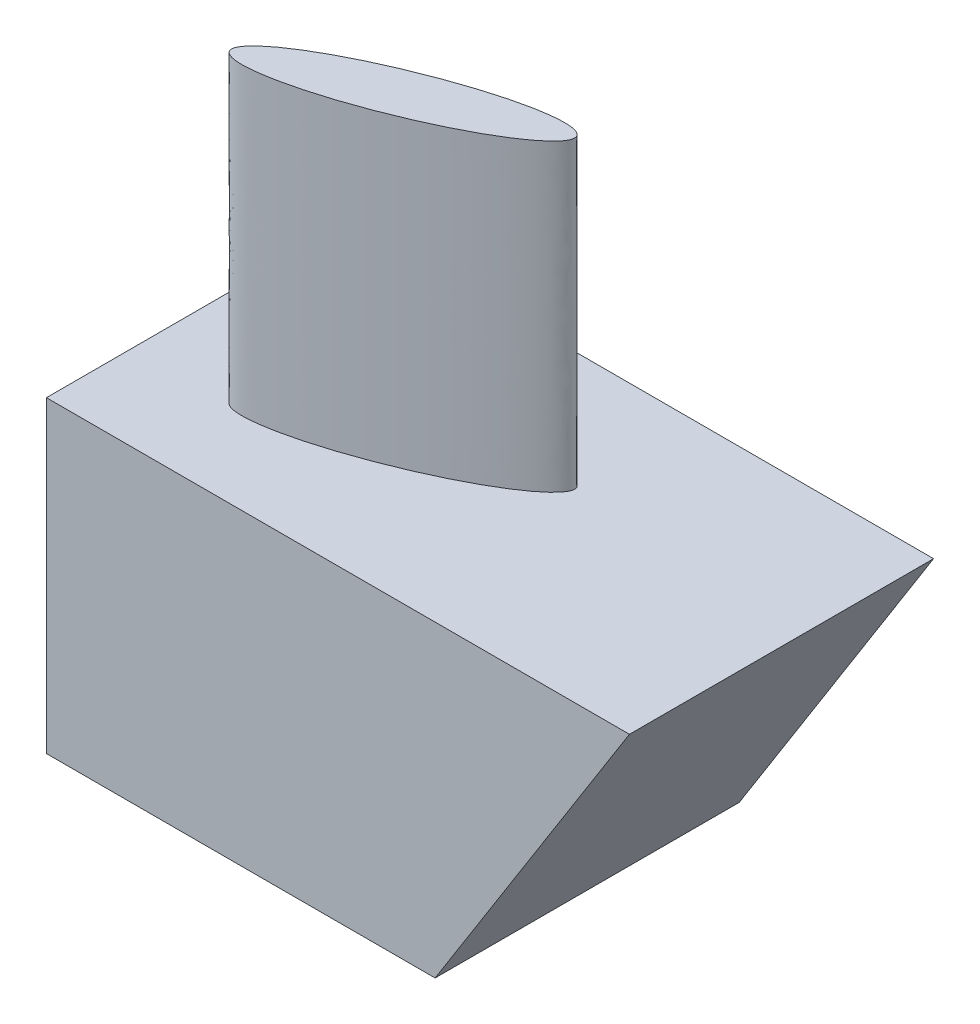
ISO-10303-21;
HEADER;
FILE_DESCRIPTION(('STEP AP214'),'2;1');
FILE_NAME('part.step','',(''),(''),'','','');
FILE_SCHEMA(('AUTOMOTIVE_DESIGN { 1 0 10303 214 1 1 1 1 }'));
ENDSEC;
DATA;
#1=APPLICATION_CONTEXT('core data for automotive mechanical design processes');
#2=APPLICATION_PROTOCOL_DEFINITION('international standard','automotive_design',2000,#1);
#3=PRODUCT_CONTEXT('',#1,'mechanical');
#4=PRODUCT('Part','Part','',(#3));
#5=PRODUCT_RELATED_PRODUCT_CATEGORY('part','',(#4));
#6=PRODUCT_DEFINITION_FORMATION('','',#4);
#7=PRODUCT_DEFINITION_CONTEXT('part definition',#1,'design');
#8=PRODUCT_DEFINITION('design','',#6,#7);
#9=PRODUCT_DEFINITION_SHAPE('','',#8);
#10=(LENGTH_UNIT() NAMED_UNIT(*) SI_UNIT(.MILLI.,.METRE.));
#11=(NAMED_UNIT(*) PLANE_ANGLE_UNIT() SI_UNIT($,.RADIAN.));
#12=(NAMED_UNIT(*) SI_UNIT($,.STERADIAN.) SOLID_ANGLE_UNIT());
#13=UNCERTAINTY_MEASURE_WITH_UNIT(LENGTH_MEASURE(1.E-05),#10,'distance_accuracy_value','');
#14=(GEOMETRIC_REPRESENTATION_CONTEXT(3) GLOBAL_UNCERTAINTY_ASSIGNED_CONTEXT((#13)) GLOBAL_UNIT_ASSIGNED_CONTEXT((#10,
#11,#12)) REPRESENTATION_CONTEXT('',''));
#15=CARTESIAN_POINT('',(0.,0.,0.));
#16=DIRECTION('',(0.,0.,1.));
#17=DIRECTION('',(1.,0.,0.));
#18=AXIS2_PLACEMENT_3D('',#15,#16,#17);
#19=CARTESIAN_POINT('',(0.,0.,79.502));
#20=DIRECTION('',(1.,0.,0.));
#21=DIRECTION('',(0.,0.,-1.));
#22=AXIS2_PLACEMENT_3D('',#19,#20,#21);
#23=PLANE('',#22);
#24=DIRECTION('',(0.,-1.,0.));
#25=VECTOR('',#24,1.);
#26=CARTESIAN_POINT('',(0.,0.,0.));
#27=LINE('',#26,#25);
#28=CARTESIAN_POINT('',(0.,80.5724673818545,0.));
#29=VERTEX_POINT('',#28);
#30=CARTESIAN_POINT('',(0.,0.,0.));
#31=VERTEX_POINT('',#30);
#32=EDGE_CURVE('E99',#29,#31,#27,.T.);
#33=ORIENTED_EDGE('',*,*,#32,.T.);
#34=DIRECTION('',(0.,0.,-1.));
#35=VECTOR('',#34,1.);
#36=CARTESIAN_POINT('',(0.,0.,79.502));
#37=LINE('',#36,#35);
#38=CARTESIAN_POINT('',(0.,0.,79.502));
#39=VERTEX_POINT('',#38);
#40=EDGE_CURVE('E41',#39,#31,#37,.T.);
#41=ORIENTED_EDGE('',*,*,#40,.F.);
#42=DIRECTION('',(0.,-1.,0.));
#43=VECTOR('',#42,1.);
#44=CARTESIAN_POINT('',(0.,0.,79.502));
#45=LINE('',#44,#43);
#46=CARTESIAN_POINT('',(0.,80.5724673818545,79.502));
#47=VERTEX_POINT('',#46);
#48=EDGE_CURVE('E85',#47,#39,#45,.T.);
#49=ORIENTED_EDGE('',*,*,#48,.F.);
#50=DIRECTION('',(0.,0.,-1.));
#51=VECTOR('',#50,1.);
#52=CARTESIAN_POINT('',(0.,80.5724673818545,79.502));
#53=LINE('',#52,#51);
#54=EDGE_CURVE('E95',#47,#29,#53,.T.);
#55=ORIENTED_EDGE('',*,*,#54,.T.);
#56=EDGE_LOOP('',(#33,#41,#49,#55));
#57=FACE_BOUND('',#56,.T.);
#58=ADVANCED_FACE('F33',(#57),#23,.F.);
#59=CARTESIAN_POINT('',(0.,0.,79.502));
#60=DIRECTION('',(0.,1.,0.));
#61=DIRECTION('',(0.,0.,1.));
#62=AXIS2_PLACEMENT_3D('',#59,#60,#61);
#63=PLANE('',#62);
#64=DIRECTION('',(1.,0.,0.));
#65=VECTOR('',#64,1.);
#66=CARTESIAN_POINT('',(0.,0.,0.));
#67=LINE('',#66,#65);
#68=CARTESIAN_POINT('',(101.6,0.,0.));
#69=VERTEX_POINT('',#68);
#70=EDGE_CURVE('E90',#31,#69,#67,.T.);
#71=ORIENTED_EDGE('',*,*,#70,.T.);
#72=DIRECTION('',(0.,0.,-1.));
#73=VECTOR('',#72,1.);
#74=CARTESIAN_POINT('',(101.6,0.,79.502));
#75=LINE('',#74,#73);
#76=CARTESIAN_POINT('',(101.6,0.,79.502));
#77=VERTEX_POINT('',#76);
#78=EDGE_CURVE('E88',#77,#69,#75,.T.);
#79=ORIENTED_EDGE('',*,*,#78,.F.);
#80=DIRECTION('',(1.,0.,0.));
#81=VECTOR('',#80,1.);
#82=CARTESIAN_POINT('',(0.,0.,79.502));
#83=LINE('',#82,#81);
#84=EDGE_CURVE('E80',#39,#77,#83,.T.);
#85=ORIENTED_EDGE('',*,*,#84,.F.);
#86=ORIENTED_EDGE('',*,*,#40,.T.);
#87=EDGE_LOOP('',(#71,#79,#85,#86));
#88=FACE_BOUND('',#87,.T.);
#89=ADVANCED_FACE('F89',(#88),#63,.F.);
#90=CARTESIAN_POINT('',(101.6,0.,79.502));
#91=DIRECTION('',(-0.845905169363301,0.533333333333333,0.));
#92=DIRECTION('',(-0.533333333333333,-0.845905169363301,0.));
#93=AXIS2_PLACEMENT_3D('',#90,#91,#92);
#94=PLANE('',#93);
#95=DIRECTION('',(0.533333333333333,0.845905169363301,0.));
#96=VECTOR('',#95,1.);
#97=CARTESIAN_POINT('',(101.6,0.,0.));
#98=LINE('',#97,#96);
#99=CARTESIAN_POINT('',(152.4,80.5724673818545,0.));
#100=VERTEX_POINT('',#99);
#101=EDGE_CURVE('E66',#69,#100,#98,.T.);
#102=ORIENTED_EDGE('',*,*,#101,.T.);
#103=DIRECTION('',(0.,0.,-1.));
#104=VECTOR('',#103,1.);
#105=CARTESIAN_POINT('',(152.4,80.5724673818545,79.502));
#106=LINE('',#105,#104);
#107=CARTESIAN_POINT('',(152.4,80.5724673818545,79.502));
#108=VERTEX_POINT('',#107);
#109=EDGE_CURVE('E91',#108,#100,#106,.T.);
#110=ORIENTED_EDGE('',*,*,#109,.F.);
#111=DIRECTION('',(0.533333333333333,0.845905169363301,0.));
#112=VECTOR('',#111,1.);
#113=CARTESIAN_POINT('',(101.6,0.,79.502));
#114=LINE('',#113,#112);
#115=EDGE_CURVE('E83',#77,#108,#114,.T.);
#116=ORIENTED_EDGE('',*,*,#115,.F.);
#117=ORIENTED_EDGE('',*,*,#78,.T.);
#118=EDGE_LOOP('',(#102,#110,#116,#117));
#119=FACE_BOUND('',#118,.T.);
#120=ADVANCED_FACE('F93',(#119),#94,.F.);
#121=CARTESIAN_POINT('',(0.,80.5724673818545,79.502));
#122=DIRECTION('',(0.,-1.,0.));
#123=DIRECTION('',(0.,0.,-1.));
#124=AXIS2_PLACEMENT_3D('',#121,#122,#123);
#125=PLANE('',#124);
#126=CARTESIAN_POINT('',(57.2688932842027,80.5724673818545,43.526743590462));
#127=DIRECTION('',(0.,1.,0.));
#128=DIRECTION('',(0.928759773710809,0.,-0.370682185620845));
#129=AXIS2_PLACEMENT_3D('',#126,#127,#128);
#130=ELLIPSE('',#129,34.8725221198214,7.13681948191102);
#131=CARTESIAN_POINT('',(89.6570890369333,80.5724673818545,30.6001208729754));
#132=VERTEX_POINT('',#131);
#133=EDGE_CURVE('E11',#132,#132,#130,.T.);
#134=ORIENTED_EDGE('',*,*,#133,.F.);
#135=EDGE_LOOP('',(#134));
#136=FACE_BOUND('',#135,.T.);
#137=DIRECTION('',(-1.,0.,0.));
#138=VECTOR('',#137,1.);
#139=CARTESIAN_POINT('',(0.,80.5724673818545,0.));
#140=LINE('',#139,#138);
#141=EDGE_CURVE('E72',#100,#29,#140,.T.);
#142=ORIENTED_EDGE('',*,*,#141,.T.);
#143=ORIENTED_EDGE('',*,*,#54,.F.);
#144=DIRECTION('',(-1.,0.,0.));
#145=VECTOR('',#144,1.);
#146=CARTESIAN_POINT('',(0.,80.5724673818545,79.502));
#147=LINE('',#146,#145);
#148=EDGE_CURVE('E49',#108,#47,#147,.T.);
#149=ORIENTED_EDGE('',*,*,#148,.F.);
#150=ORIENTED_EDGE('',*,*,#109,.T.);
#151=EDGE_LOOP('',(#142,#143,#149,#150));
#152=FACE_BOUND('',#151,.T.);
#153=ADVANCED_FACE('F121',(#136,#152),#125,.F.);
#154=CARTESIAN_POINT('',(0.,0.,79.502));
#155=DIRECTION('',(0.,0.,-1.));
#156=DIRECTION('',(-1.,0.,0.));
#157=AXIS2_PLACEMENT_3D('',#154,#155,#156);
#158=PLANE('',#157);
#159=ORIENTED_EDGE('',*,*,#48,.T.);
#160=ORIENTED_EDGE('',*,*,#84,.T.);
#161=ORIENTED_EDGE('',*,*,#115,.T.);
#162=ORIENTED_EDGE('',*,*,#148,.T.);
#163=EDGE_LOOP('',(#159,#160,#161,#162));
#164=FACE_BOUND('',#163,.T.);
#165=ADVANCED_FACE('F81',(#164),#158,.F.);
#166=CARTESIAN_POINT('',(0.,0.,0.));
#167=DIRECTION('',(0.,0.,-1.));
#168=DIRECTION('',(-1.,0.,0.));
#169=AXIS2_PLACEMENT_3D('',#166,#167,#168);
#170=PLANE('',#169);
#171=ORIENTED_EDGE('',*,*,#32,.F.);
#172=ORIENTED_EDGE('',*,*,#141,.F.);
#173=ORIENTED_EDGE('',*,*,#101,.F.);
#174=ORIENTED_EDGE('',*,*,#70,.F.);
#175=EDGE_LOOP('',(#171,#172,#173,#174));
#176=FACE_BOUND('',#175,.T.);
#177=ADVANCED_FACE('F110',(#176),#170,.T.);
#178=CARTESIAN_POINT('',(57.2688932842027,160.074467381854,43.526743590462));
#179=DIRECTION('',(0.,1.,0.));
#180=DIRECTION('',(0.928759773710809,0.,-0.370682185620845));
#181=AXIS2_PLACEMENT_3D('',#178,#179,#180);
#182=ELLIPSE('',#181,34.8725221198214,7.13681948191102);
#183=DIRECTION('',(0.,-1.,0.));
#184=VECTOR('',#183,1.);
#185=SURFACE_OF_LINEAR_EXTRUSION('',#182,#184);
#186=CARTESIAN_POINT('',(89.6570890369333,160.074467381854,30.6001208729754));
#187=VERTEX_POINT('',#186);
#188=EDGE_CURVE('E102',#187,#187,#182,.T.);
#189=ORIENTED_EDGE('',*,*,#188,.F.);
#190=EDGE_LOOP('',(#189));
#191=FACE_BOUND('',#190,.T.);
#192=ORIENTED_EDGE('',*,*,#133,.T.);
#193=EDGE_LOOP('',(#192));
#194=FACE_BOUND('',#193,.T.);
#195=ADVANCED_FACE('F112',(#191,#194),#185,.F.);
#196=CARTESIAN_POINT('',(57.2688932842027,160.074467381854,43.526743590462));
#197=DIRECTION('',(0.,1.,0.));
#198=DIRECTION('',(0.,0.,1.));
#199=AXIS2_PLACEMENT_3D('',#196,#197,#198);
#200=PLANE('',#199);
#201=ORIENTED_EDGE('',*,*,#188,.T.);
#202=EDGE_LOOP('',(#201));
#203=FACE_BOUND('',#202,.T.);
#204=ADVANCED_FACE('F118',(#203),#200,.T.);
#205=CLOSED_SHELL('',(#58,#89,#120,#153,#165,#177,#195,#204));
#206=MANIFOLD_SOLID_BREP('B2',#205);
#207=ADVANCED_BREP_SHAPE_REPRESENTATION('',(#18,#206),#14);
#208=SHAPE_DEFINITION_REPRESENTATION(#9,#207);
ENDSEC;
END-ISO-10303-21;
